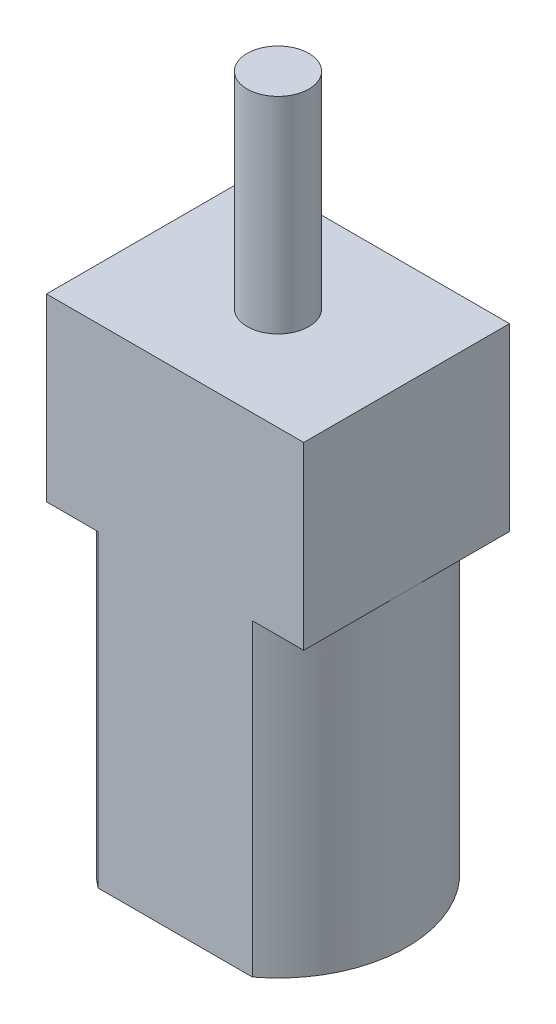
ISO-10303-21;
HEADER;
FILE_DESCRIPTION(('STEP AP214'),'2;1');
FILE_NAME('part.step','',(''),(''),'','','');
FILE_SCHEMA(('AUTOMOTIVE_DESIGN { 1 0 10303 214 1 1 1 1 }'));
ENDSEC;
DATA;
#1=APPLICATION_CONTEXT('core data for automotive mechanical design processes');
#2=APPLICATION_PROTOCOL_DEFINITION('international standard','automotive_design',2000,#1);
#3=PRODUCT_CONTEXT('',#1,'mechanical');
#4=PRODUCT('Part','Part','',(#3));
#5=PRODUCT_RELATED_PRODUCT_CATEGORY('part','',(#4));
#6=PRODUCT_DEFINITION_FORMATION('','',#4);
#7=PRODUCT_DEFINITION_CONTEXT('part definition',#1,'design');
#8=PRODUCT_DEFINITION('design','',#6,#7);
#9=PRODUCT_DEFINITION_SHAPE('','',#8);
#10=(LENGTH_UNIT() NAMED_UNIT(*) SI_UNIT(.MILLI.,.METRE.));
#11=(NAMED_UNIT(*) PLANE_ANGLE_UNIT() SI_UNIT($,.RADIAN.));
#12=(NAMED_UNIT(*) SI_UNIT($,.STERADIAN.) SOLID_ANGLE_UNIT());
#13=UNCERTAINTY_MEASURE_WITH_UNIT(LENGTH_MEASURE(1.E-05),#10,'distance_accuracy_value','');
#14=(GEOMETRIC_REPRESENTATION_CONTEXT(3) GLOBAL_UNCERTAINTY_ASSIGNED_CONTEXT((#13)) GLOBAL_UNIT_ASSIGNED_CONTEXT((#10,
#11,#12)) REPRESENTATION_CONTEXT('',''));
#15=CARTESIAN_POINT('',(0.,0.,0.));
#16=DIRECTION('',(0.,0.,1.));
#17=DIRECTION('',(1.,0.,0.));
#18=AXIS2_PLACEMENT_3D('',#15,#16,#17);
#19=CARTESIAN_POINT('',(0.,15.24,0.));
#20=DIRECTION('',(0.,-1.,0.));
#21=DIRECTION('',(0.,0.,-1.));
#22=AXIS2_PLACEMENT_3D('',#19,#20,#21);
#23=CYLINDRICAL_SURFACE('',#22,6.35);
#24=DIRECTION('',(0.,1.,0.));
#25=VECTOR('',#24,1.);
#26=CARTESIAN_POINT('',(3.81,0.,-5.08));
#27=LINE('',#26,#25);
#28=CARTESIAN_POINT('',(3.81,0.,-5.08));
#29=VERTEX_POINT('',#28);
#30=CARTESIAN_POINT('',(3.81,15.24,-5.08));
#31=VERTEX_POINT('',#30);
#32=EDGE_CURVE('E64',#29,#31,#27,.T.);
#33=ORIENTED_EDGE('',*,*,#32,.T.);
#34=CARTESIAN_POINT('',(0.,15.24,0.));
#35=DIRECTION('',(0.,1.,0.));
#36=DIRECTION('',(0.,0.,1.));
#37=AXIS2_PLACEMENT_3D('',#34,#35,#36);
#38=CIRCLE('',#37,6.35);
#39=CARTESIAN_POINT('',(6.35,15.24,0.));
#40=VERTEX_POINT('',#39);
#41=EDGE_CURVE('E150',#40,#31,#38,.T.);
#42=ORIENTED_EDGE('',*,*,#41,.F.);
#43=CARTESIAN_POINT('',(3.80999999999999,15.24,5.08));
#44=VERTEX_POINT('',#43);
#45=EDGE_CURVE('E48',#44,#40,#38,.T.);
#46=ORIENTED_EDGE('',*,*,#45,.F.);
#47=DIRECTION('',(0.,1.,0.));
#48=VECTOR('',#47,1.);
#49=CARTESIAN_POINT('',(3.80999999999999,0.,5.08));
#50=LINE('',#49,#48);
#51=CARTESIAN_POINT('',(3.80999999999999,0.,5.08));
#52=VERTEX_POINT('',#51);
#53=EDGE_CURVE('E120',#52,#44,#50,.T.);
#54=ORIENTED_EDGE('',*,*,#53,.F.);
#55=CARTESIAN_POINT('',(0.,0.,0.));
#56=DIRECTION('',(0.,1.,0.));
#57=DIRECTION('',(0.,0.,1.));
#58=AXIS2_PLACEMENT_3D('',#55,#56,#57);
#59=CIRCLE('',#58,6.35);
#60=EDGE_CURVE('E42',#52,#29,#59,.T.);
#61=ORIENTED_EDGE('',*,*,#60,.T.);
#62=EDGE_LOOP('',(#33,#42,#46,#54,#61));
#63=FACE_BOUND('',#62,.T.);
#64=ADVANCED_FACE('F39',(#63),#23,.T.);
#65=DIRECTION('',(0.,1.,0.));
#66=VECTOR('',#65,1.);
#67=CARTESIAN_POINT('',(-3.81,0.,-5.08));
#68=LINE('',#67,#66);
#69=CARTESIAN_POINT('',(-3.81,0.,-5.08));
#70=VERTEX_POINT('',#69);
#71=CARTESIAN_POINT('',(-3.81,15.24,-5.08));
#72=VERTEX_POINT('',#71);
#73=EDGE_CURVE('E113',#70,#72,#68,.T.);
#74=ORIENTED_EDGE('',*,*,#73,.F.);
#75=CARTESIAN_POINT('',(-3.80999999999999,0.,5.08));
#76=VERTEX_POINT('',#75);
#77=EDGE_CURVE('E125',#70,#76,#59,.T.);
#78=ORIENTED_EDGE('',*,*,#77,.T.);
#79=DIRECTION('',(0.,1.,0.));
#80=VECTOR('',#79,1.);
#81=CARTESIAN_POINT('',(-3.80999999999999,0.,5.08));
#82=LINE('',#81,#80);
#83=CARTESIAN_POINT('',(-3.80999999999999,15.24,5.08));
#84=VERTEX_POINT('',#83);
#85=EDGE_CURVE('E56',#76,#84,#82,.T.);
#86=ORIENTED_EDGE('',*,*,#85,.T.);
#87=CARTESIAN_POINT('',(-6.35,15.24,0.));
#88=VERTEX_POINT('',#87);
#89=EDGE_CURVE('E138',#88,#84,#38,.T.);
#90=ORIENTED_EDGE('',*,*,#89,.F.);
#91=EDGE_CURVE('E127',#72,#88,#38,.T.);
#92=ORIENTED_EDGE('',*,*,#91,.F.);
#93=EDGE_LOOP('',(#74,#78,#86,#90,#92));
#94=FACE_BOUND('',#93,.T.);
#95=ADVANCED_FACE('F124',(#94),#23,.T.);
#96=CARTESIAN_POINT('',(0.,0.,0.));
#97=DIRECTION('',(0.,1.,0.));
#98=DIRECTION('',(0.,0.,1.));
#99=AXIS2_PLACEMENT_3D('',#96,#97,#98);
#100=PLANE('',#99);
#101=DIRECTION('',(-1.,0.,0.));
#102=VECTOR('',#101,1.);
#103=CARTESIAN_POINT('',(0.,0.,-5.08));
#104=LINE('',#103,#102);
#105=EDGE_CURVE('E109',#29,#70,#104,.T.);
#106=ORIENTED_EDGE('',*,*,#105,.F.);
#107=ORIENTED_EDGE('',*,*,#60,.F.);
#108=DIRECTION('',(1.,0.,0.));
#109=VECTOR('',#108,1.);
#110=CARTESIAN_POINT('',(0.,0.,5.08));
#111=LINE('',#110,#109);
#112=EDGE_CURVE('E133',#76,#52,#111,.T.);
#113=ORIENTED_EDGE('',*,*,#112,.F.);
#114=ORIENTED_EDGE('',*,*,#77,.F.);
#115=EDGE_LOOP('',(#106,#107,#113,#114));
#116=FACE_BOUND('',#115,.T.);
#117=ADVANCED_FACE('F132',(#116),#100,.F.);
#118=CARTESIAN_POINT('',(0.,15.24,0.));
#119=DIRECTION('',(0.,-1.,0.));
#120=DIRECTION('',(0.,0.,-1.));
#121=AXIS2_PLACEMENT_3D('',#118,#119,#120);
#122=PLANE('',#121);
#123=DIRECTION('',(1.,0.,0.));
#124=VECTOR('',#123,1.);
#125=CARTESIAN_POINT('',(-6.35,15.24,5.08));
#126=LINE('',#125,#124);
#127=CARTESIAN_POINT('',(6.35,15.24,5.08));
#128=VERTEX_POINT('',#127);
#129=EDGE_CURVE('E182',#44,#128,#126,.T.);
#130=ORIENTED_EDGE('',*,*,#129,.F.);
#131=ORIENTED_EDGE('',*,*,#45,.T.);
#132=DIRECTION('',(0.,0.,-1.));
#133=VECTOR('',#132,1.);
#134=CARTESIAN_POINT('',(6.35,15.24,5.08));
#135=LINE('',#134,#133);
#136=EDGE_CURVE('E208',#128,#40,#135,.T.);
#137=ORIENTED_EDGE('',*,*,#136,.F.);
#138=EDGE_LOOP('',(#130,#131,#137));
#139=FACE_BOUND('',#138,.T.);
#140=ADVANCED_FACE('F234',(#139),#122,.T.);
#141=CARTESIAN_POINT('',(6.35,15.24,-5.08));
#142=VERTEX_POINT('',#141);
#143=EDGE_CURVE('E130',#40,#142,#135,.T.);
#144=ORIENTED_EDGE('',*,*,#143,.F.);
#145=ORIENTED_EDGE('',*,*,#41,.T.);
#146=DIRECTION('',(-1.,0.,0.));
#147=VECTOR('',#146,1.);
#148=CARTESIAN_POINT('',(-6.35,15.24,-5.08));
#149=LINE('',#148,#147);
#150=EDGE_CURVE('E177',#142,#31,#149,.T.);
#151=ORIENTED_EDGE('',*,*,#150,.F.);
#152=EDGE_LOOP('',(#144,#145,#151));
#153=FACE_BOUND('',#152,.T.);
#154=ADVANCED_FACE('F218',(#153),#122,.T.);
#155=CARTESIAN_POINT('',(-6.35,15.24,-5.08));
#156=VERTEX_POINT('',#155);
#157=EDGE_CURVE('E169',#72,#156,#149,.T.);
#158=ORIENTED_EDGE('',*,*,#157,.F.);
#159=ORIENTED_EDGE('',*,*,#91,.T.);
#160=DIRECTION('',(0.,0.,1.));
#161=VECTOR('',#160,1.);
#162=CARTESIAN_POINT('',(-6.35,15.24,5.08));
#163=LINE('',#162,#161);
#164=EDGE_CURVE('E168',#156,#88,#163,.T.);
#165=ORIENTED_EDGE('',*,*,#164,.F.);
#166=EDGE_LOOP('',(#158,#159,#165));
#167=FACE_BOUND('',#166,.T.);
#168=ADVANCED_FACE('F166',(#167),#122,.T.);
#169=CARTESIAN_POINT('',(6.35,24.13,5.08));
#170=DIRECTION('',(-1.,0.,0.));
#171=DIRECTION('',(0.,0.,1.));
#172=AXIS2_PLACEMENT_3D('',#169,#170,#171);
#173=PLANE('',#172);
#174=ORIENTED_EDGE('',*,*,#136,.T.);
#175=ORIENTED_EDGE('',*,*,#143,.T.);
#176=DIRECTION('',(0.,-1.,0.));
#177=VECTOR('',#176,1.);
#178=CARTESIAN_POINT('',(6.35,24.13,-5.08));
#179=LINE('',#178,#177);
#180=CARTESIAN_POINT('',(6.35,24.13,-5.08));
#181=VERTEX_POINT('',#180);
#182=EDGE_CURVE('E135',#181,#142,#179,.T.);
#183=ORIENTED_EDGE('',*,*,#182,.F.);
#184=DIRECTION('',(0.,0.,-1.));
#185=VECTOR('',#184,1.);
#186=CARTESIAN_POINT('',(6.35,24.13,5.08));
#187=LINE('',#186,#185);
#188=CARTESIAN_POINT('',(6.35,24.13,5.08));
#189=VERTEX_POINT('',#188);
#190=EDGE_CURVE('E189',#189,#181,#187,.T.);
#191=ORIENTED_EDGE('',*,*,#190,.F.);
#192=DIRECTION('',(0.,-1.,0.));
#193=VECTOR('',#192,1.);
#194=CARTESIAN_POINT('',(6.35,24.13,5.08));
#195=LINE('',#194,#193);
#196=EDGE_CURVE('E190',#189,#128,#195,.T.);
#197=ORIENTED_EDGE('',*,*,#196,.T.);
#198=EDGE_LOOP('',(#174,#175,#183,#191,#197));
#199=FACE_BOUND('',#198,.T.);
#200=ADVANCED_FACE('F215',(#199),#173,.F.);
#201=CARTESIAN_POINT('',(-6.35,24.13,-5.08));
#202=DIRECTION('',(0.,0.,1.));
#203=DIRECTION('',(1.,0.,0.));
#204=AXIS2_PLACEMENT_3D('',#201,#202,#203);
#205=PLANE('',#204);
#206=DIRECTION('',(0.,-1.,0.));
#207=VECTOR('',#206,1.);
#208=CARTESIAN_POINT('',(-6.35,24.13,-5.08));
#209=LINE('',#208,#207);
#210=CARTESIAN_POINT('',(-6.35,24.13,-5.08));
#211=VERTEX_POINT('',#210);
#212=EDGE_CURVE('E140',#211,#156,#209,.T.);
#213=ORIENTED_EDGE('',*,*,#212,.F.);
#214=DIRECTION('',(-1.,0.,0.));
#215=VECTOR('',#214,1.);
#216=CARTESIAN_POINT('',(-6.35,24.13,-5.08));
#217=LINE('',#216,#215);
#218=EDGE_CURVE('E201',#181,#211,#217,.T.);
#219=ORIENTED_EDGE('',*,*,#218,.F.);
#220=ORIENTED_EDGE('',*,*,#182,.T.);
#221=ORIENTED_EDGE('',*,*,#150,.T.);
#222=ORIENTED_EDGE('',*,*,#32,.F.);
#223=ORIENTED_EDGE('',*,*,#105,.T.);
#224=ORIENTED_EDGE('',*,*,#73,.T.);
#225=ORIENTED_EDGE('',*,*,#157,.T.);
#226=EDGE_LOOP('',(#213,#219,#220,#221,#222,#223,#224,#225));
#227=FACE_BOUND('',#226,.T.);
#228=ADVANCED_FACE('F112',(#227),#205,.F.);
#229=CARTESIAN_POINT('',(-6.35,24.13,5.08));
#230=DIRECTION('',(1.,0.,0.));
#231=DIRECTION('',(0.,0.,-1.));
#232=AXIS2_PLACEMENT_3D('',#229,#230,#231);
#233=PLANE('',#232);
#234=ORIENTED_EDGE('',*,*,#164,.T.);
#235=CARTESIAN_POINT('',(-6.35,15.24,5.08));
#236=VERTEX_POINT('',#235);
#237=EDGE_CURVE('E170',#88,#236,#163,.T.);
#238=ORIENTED_EDGE('',*,*,#237,.T.);
#239=DIRECTION('',(0.,-1.,0.));
#240=VECTOR('',#239,1.);
#241=CARTESIAN_POINT('',(-6.35,24.13,5.08));
#242=LINE('',#241,#240);
#243=CARTESIAN_POINT('',(-6.35,24.13,5.08));
#244=VERTEX_POINT('',#243);
#245=EDGE_CURVE('E145',#244,#236,#242,.T.);
#246=ORIENTED_EDGE('',*,*,#245,.F.);
#247=DIRECTION('',(0.,0.,1.));
#248=VECTOR('',#247,1.);
#249=CARTESIAN_POINT('',(-6.35,24.13,5.08));
#250=LINE('',#249,#248);
#251=EDGE_CURVE('E198',#211,#244,#250,.T.);
#252=ORIENTED_EDGE('',*,*,#251,.F.);
#253=ORIENTED_EDGE('',*,*,#212,.T.);
#254=EDGE_LOOP('',(#234,#238,#246,#252,#253));
#255=FACE_BOUND('',#254,.T.);
#256=ADVANCED_FACE('F179',(#255),#233,.F.);
#257=CARTESIAN_POINT('',(-6.35,24.13,5.08));
#258=DIRECTION('',(0.,0.,-1.));
#259=DIRECTION('',(-1.,0.,0.));
#260=AXIS2_PLACEMENT_3D('',#257,#258,#259);
#261=PLANE('',#260);
#262=ORIENTED_EDGE('',*,*,#196,.F.);
#263=DIRECTION('',(1.,0.,0.));
#264=VECTOR('',#263,1.);
#265=CARTESIAN_POINT('',(-6.35,24.13,5.08));
#266=LINE('',#265,#264);
#267=EDGE_CURVE('E193',#244,#189,#266,.T.);
#268=ORIENTED_EDGE('',*,*,#267,.F.);
#269=ORIENTED_EDGE('',*,*,#245,.T.);
#270=EDGE_CURVE('E172',#236,#84,#126,.T.);
#271=ORIENTED_EDGE('',*,*,#270,.T.);
#272=ORIENTED_EDGE('',*,*,#85,.F.);
#273=ORIENTED_EDGE('',*,*,#112,.T.);
#274=ORIENTED_EDGE('',*,*,#53,.T.);
#275=ORIENTED_EDGE('',*,*,#129,.T.);
#276=EDGE_LOOP('',(#262,#268,#269,#271,#272,#273,#274,#275));
#277=FACE_BOUND('',#276,.T.);
#278=ADVANCED_FACE('F197',(#277),#261,.F.);
#279=CARTESIAN_POINT('',(0.,24.13,0.));
#280=DIRECTION('',(0.,-1.,0.));
#281=DIRECTION('',(0.,0.,-1.));
#282=AXIS2_PLACEMENT_3D('',#279,#280,#281);
#283=PLANE('',#282);
#284=CARTESIAN_POINT('',(0.,24.13,0.));
#285=DIRECTION('',(0.,1.,0.));
#286=DIRECTION('',(0.,0.,1.));
#287=AXIS2_PLACEMENT_3D('',#284,#285,#286);
#288=CIRCLE('',#287,1.524);
#289=CARTESIAN_POINT('',(0.,24.13,1.524));
#290=VERTEX_POINT('',#289);
#291=EDGE_CURVE('E11',#290,#290,#288,.T.);
#292=ORIENTED_EDGE('',*,*,#291,.F.);
#293=EDGE_LOOP('',(#292));
#294=FACE_BOUND('',#293,.T.);
#295=ORIENTED_EDGE('',*,*,#190,.T.);
#296=ORIENTED_EDGE('',*,*,#218,.T.);
#297=ORIENTED_EDGE('',*,*,#251,.T.);
#298=ORIENTED_EDGE('',*,*,#267,.T.);
#299=EDGE_LOOP('',(#295,#296,#297,#298));
#300=FACE_BOUND('',#299,.T.);
#301=ADVANCED_FACE('F233',(#294,#300),#283,.F.);
#302=ORIENTED_EDGE('',*,*,#237,.F.);
#303=ORIENTED_EDGE('',*,*,#89,.T.);
#304=ORIENTED_EDGE('',*,*,#270,.F.);
#305=EDGE_LOOP('',(#302,#303,#304));
#306=FACE_BOUND('',#305,.T.);
#307=ADVANCED_FACE('F171',(#306),#122,.T.);
#308=CARTESIAN_POINT('',(0.,34.29,0.));
#309=DIRECTION('',(0.,-1.,0.));
#310=DIRECTION('',(0.,0.,-1.));
#311=AXIS2_PLACEMENT_3D('',#308,#309,#310);
#312=CYLINDRICAL_SURFACE('',#311,1.524);
#313=CARTESIAN_POINT('',(0.,34.29,0.));
#314=DIRECTION('',(0.,1.,0.));
#315=DIRECTION('',(0.,0.,1.));
#316=AXIS2_PLACEMENT_3D('',#313,#314,#315);
#317=CIRCLE('',#316,1.524);
#318=CARTESIAN_POINT('',(0.,34.29,1.524));
#319=VERTEX_POINT('',#318);
#320=EDGE_CURVE('E227',#319,#319,#317,.T.);
#321=ORIENTED_EDGE('',*,*,#320,.F.);
#322=EDGE_LOOP('',(#321));
#323=FACE_BOUND('',#322,.T.);
#324=ORIENTED_EDGE('',*,*,#291,.T.);
#325=EDGE_LOOP('',(#324));
#326=FACE_BOUND('',#325,.T.);
#327=ADVANCED_FACE('F244',(#323,#326),#312,.T.);
#328=CARTESIAN_POINT('',(0.,34.29,0.));
#329=DIRECTION('',(0.,1.,0.));
#330=DIRECTION('',(0.,0.,1.));
#331=AXIS2_PLACEMENT_3D('',#328,#329,#330);
#332=PLANE('',#331);
#333=ORIENTED_EDGE('',*,*,#320,.T.);
#334=EDGE_LOOP('',(#333));
#335=FACE_BOUND('',#334,.T.);
#336=ADVANCED_FACE('F316',(#335),#332,.T.);
#337=CLOSED_SHELL('',(#64,#95,#117,#140,#154,#168,#200,#228,#256,#278,#301,#307,#327,#336));
#338=MANIFOLD_SOLID_BREP('B2',#337);
#339=ADVANCED_BREP_SHAPE_REPRESENTATION('',(#18,#338),#14);
#340=SHAPE_DEFINITION_REPRESENTATION(#9,#339);
ENDSEC;
END-ISO-10303-21;
